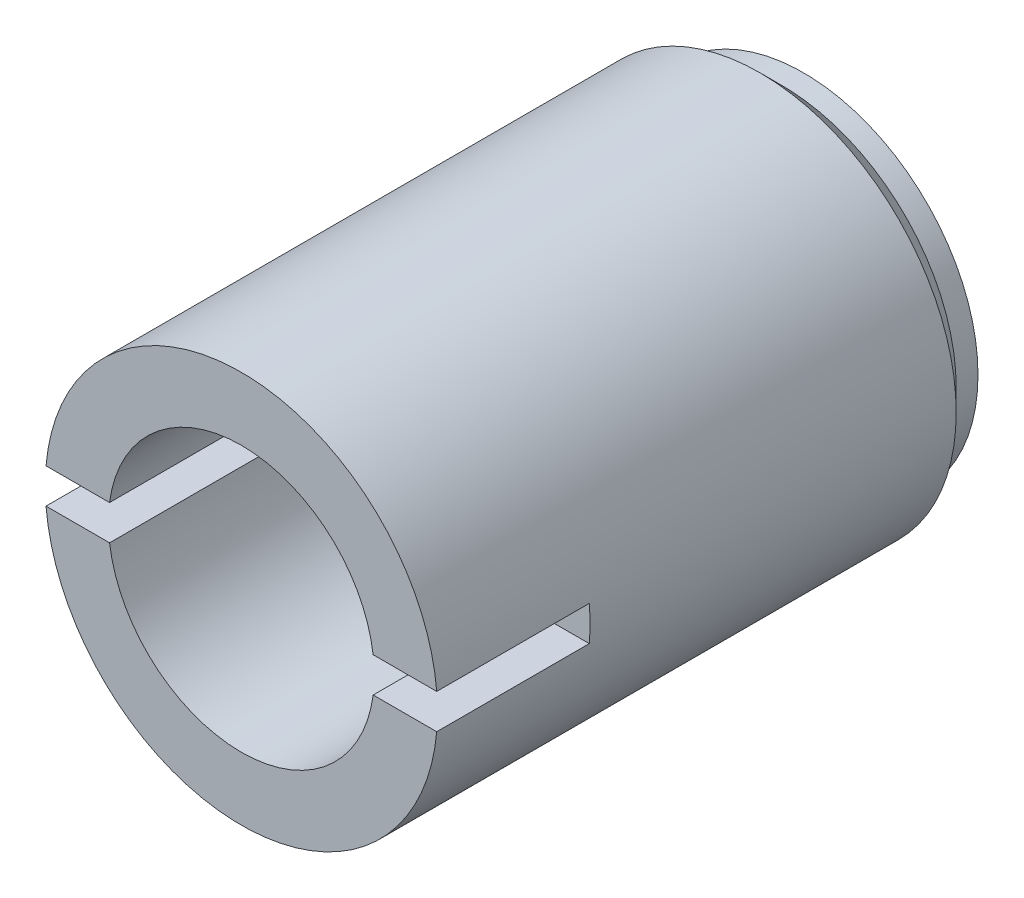
ISO-10303-21;
HEADER;
FILE_DESCRIPTION(('STEP AP214'),'2;1');
FILE_NAME('part.step','',(''),(''),'','','');
FILE_SCHEMA(('AUTOMOTIVE_DESIGN { 1 0 10303 214 1 1 1 1 }'));
ENDSEC;
DATA;
#1=APPLICATION_CONTEXT('core data for automotive mechanical design processes');
#2=APPLICATION_PROTOCOL_DEFINITION('international standard','automotive_design',2000,#1);
#3=PRODUCT_CONTEXT('',#1,'mechanical');
#4=PRODUCT('Part','Part','',(#3));
#5=PRODUCT_RELATED_PRODUCT_CATEGORY('part','',(#4));
#6=PRODUCT_DEFINITION_FORMATION('','',#4);
#7=PRODUCT_DEFINITION_CONTEXT('part definition',#1,'design');
#8=PRODUCT_DEFINITION('design','',#6,#7);
#9=PRODUCT_DEFINITION_SHAPE('','',#8);
#10=(LENGTH_UNIT() NAMED_UNIT(*) SI_UNIT(.MILLI.,.METRE.));
#11=(NAMED_UNIT(*) PLANE_ANGLE_UNIT() SI_UNIT($,.RADIAN.));
#12=(NAMED_UNIT(*) SI_UNIT($,.STERADIAN.) SOLID_ANGLE_UNIT());
#13=UNCERTAINTY_MEASURE_WITH_UNIT(LENGTH_MEASURE(1.E-05),#10,'distance_accuracy_value','');
#14=(GEOMETRIC_REPRESENTATION_CONTEXT(3) GLOBAL_UNCERTAINTY_ASSIGNED_CONTEXT((#13)) GLOBAL_UNIT_ASSIGNED_CONTEXT((#10,
#11,#12)) REPRESENTATION_CONTEXT('',''));
#15=CARTESIAN_POINT('',(0.,0.,0.));
#16=DIRECTION('',(0.,0.,1.));
#17=DIRECTION('',(1.,0.,0.));
#18=AXIS2_PLACEMENT_3D('',#15,#16,#17);
#19=CARTESIAN_POINT('',(0.,0.,12.9));
#20=DIRECTION('',(0.,0.,1.));
#21=DIRECTION('',(1.,0.,0.));
#22=AXIS2_PLACEMENT_3D('',#19,#20,#21);
#23=PLANE('',#22);
#24=CARTESIAN_POINT('',(0.,0.,12.9));
#25=DIRECTION('',(0.,0.,1.));
#26=DIRECTION('',(1.,0.,0.));
#27=AXIS2_PLACEMENT_3D('',#24,#25,#26);
#28=CIRCLE('',#27,4.5);
#29=CARTESIAN_POINT('',(4.48218696620299,0.400000000000001,12.9));
#30=VERTEX_POINT('',#29);
#31=CARTESIAN_POINT('',(-4.48218696620299,0.400000000000001,12.9));
#32=VERTEX_POINT('',#31);
#33=EDGE_CURVE('E156',#30,#32,#28,.T.);
#34=ORIENTED_EDGE('',*,*,#33,.T.);
#35=DIRECTION('',(1.,0.,0.));
#36=VECTOR('',#35,1.);
#37=CARTESIAN_POINT('',(-4.5,0.400000000000001,12.9));
#38=LINE('',#37,#36);
#39=CARTESIAN_POINT('',(-3.02365672654817,0.400000000000001,12.9));
#40=VERTEX_POINT('',#39);
#41=EDGE_CURVE('E176',#32,#40,#38,.T.);
#42=ORIENTED_EDGE('',*,*,#41,.T.);
#43=CARTESIAN_POINT('',(0.,0.,12.9));
#44=DIRECTION('',(0.,0.,1.));
#45=DIRECTION('',(1.,0.,0.));
#46=AXIS2_PLACEMENT_3D('',#43,#44,#45);
#47=CIRCLE('',#46,3.05);
#48=CARTESIAN_POINT('',(3.02365672654817,0.400000000000001,12.9));
#49=VERTEX_POINT('',#48);
#50=EDGE_CURVE('E148',#49,#40,#47,.T.);
#51=ORIENTED_EDGE('',*,*,#50,.F.);
#52=EDGE_CURVE('E65',#49,#30,#38,.T.);
#53=ORIENTED_EDGE('',*,*,#52,.T.);
#54=EDGE_LOOP('',(#34,#42,#51,#53));
#55=FACE_BOUND('',#54,.T.);
#56=ADVANCED_FACE('F41',(#55),#23,.T.);
#57=CARTESIAN_POINT('',(0.,0.,7.9));
#58=DIRECTION('',(0.,0.,1.));
#59=DIRECTION('',(1.,0.,0.));
#60=AXIS2_PLACEMENT_3D('',#57,#58,#59);
#61=PLANE('',#60);
#62=CARTESIAN_POINT('',(0.,0.,7.9));
#63=DIRECTION('',(0.,0.,1.));
#64=DIRECTION('',(1.,0.,0.));
#65=AXIS2_PLACEMENT_3D('',#62,#63,#64);
#66=CIRCLE('',#65,1.6);
#67=CARTESIAN_POINT('',(1.6,0.,7.9));
#68=VERTEX_POINT('',#67);
#69=EDGE_CURVE('E157',#68,#68,#66,.T.);
#70=ORIENTED_EDGE('',*,*,#69,.F.);
#71=EDGE_LOOP('',(#70));
#72=FACE_BOUND('',#71,.T.);
#73=CARTESIAN_POINT('',(0.,0.,7.9));
#74=DIRECTION('',(0.,0.,1.));
#75=DIRECTION('',(1.,0.,0.));
#76=AXIS2_PLACEMENT_3D('',#73,#74,#75);
#77=CIRCLE('',#76,3.05);
#78=CARTESIAN_POINT('',(3.05,0.,7.9));
#79=VERTEX_POINT('',#78);
#80=EDGE_CURVE('E122',#79,#79,#77,.F.);
#81=ORIENTED_EDGE('',*,*,#80,.F.);
#82=EDGE_LOOP('',(#81));
#83=FACE_BOUND('',#82,.T.);
#84=ADVANCED_FACE('F195',(#72,#83),#61,.T.);
#85=CARTESIAN_POINT('',(0.,0.,0.));
#86=DIRECTION('',(0.,0.,1.));
#87=DIRECTION('',(1.,0.,0.));
#88=AXIS2_PLACEMENT_3D('',#85,#86,#87);
#89=PLANE('',#88);
#90=CARTESIAN_POINT('',(0.,0.,0.));
#91=DIRECTION('',(0.,0.,1.));
#92=DIRECTION('',(1.,0.,0.));
#93=AXIS2_PLACEMENT_3D('',#90,#91,#92);
#94=CIRCLE('',#93,1.6);
#95=CARTESIAN_POINT('',(1.6,0.,0.));
#96=VERTEX_POINT('',#95);
#97=EDGE_CURVE('E160',#96,#96,#94,.T.);
#98=ORIENTED_EDGE('',*,*,#97,.T.);
#99=EDGE_LOOP('',(#98));
#100=FACE_BOUND('',#99,.T.);
#101=CARTESIAN_POINT('',(0.,0.,0.));
#102=DIRECTION('',(0.,0.,-1.));
#103=DIRECTION('',(-1.,0.,0.));
#104=AXIS2_PLACEMENT_3D('',#101,#102,#103);
#105=CIRCLE('',#104,4.);
#106=CARTESIAN_POINT('',(-4.,0.,0.));
#107=VERTEX_POINT('',#106);
#108=EDGE_CURVE('E129',#107,#107,#105,.T.);
#109=ORIENTED_EDGE('',*,*,#108,.T.);
#110=EDGE_LOOP('',(#109));
#111=FACE_BOUND('',#110,.T.);
#112=ADVANCED_FACE('F191',(#100,#111),#89,.F.);
#113=CARTESIAN_POINT('',(0.,0.,0.5));
#114=DIRECTION('',(0.,0.,-1.));
#115=DIRECTION('',(-1.,0.,0.));
#116=AXIS2_PLACEMENT_3D('',#113,#114,#115);
#117=CYLINDRICAL_SURFACE('',#116,1.6);
#118=ORIENTED_EDGE('',*,*,#97,.F.);
#119=EDGE_LOOP('',(#118));
#120=FACE_BOUND('',#119,.T.);
#121=ORIENTED_EDGE('',*,*,#69,.T.);
#122=EDGE_LOOP('',(#121));
#123=FACE_BOUND('',#122,.T.);
#124=ADVANCED_FACE('F202',(#120,#123),#117,.F.);
#125=CARTESIAN_POINT('',(0.,0.,7.9));
#126=DIRECTION('',(0.,0.,-1.));
#127=DIRECTION('',(-1.,0.,0.));
#128=AXIS2_PLACEMENT_3D('',#125,#126,#127);
#129=CYLINDRICAL_SURFACE('',#128,4.5);
#130=CARTESIAN_POINT('',(0.,0.,0.999999999999999));
#131=DIRECTION('',(0.,0.,1.));
#132=DIRECTION('',(1.,0.,0.));
#133=AXIS2_PLACEMENT_3D('',#130,#131,#132);
#134=CIRCLE('',#133,4.5);
#135=CARTESIAN_POINT('',(4.5,0.,0.999999999999999));
#136=VERTEX_POINT('',#135);
#137=EDGE_CURVE('E161',#136,#136,#134,.T.);
#138=ORIENTED_EDGE('',*,*,#137,.T.);
#139=EDGE_LOOP('',(#138));
#140=FACE_BOUND('',#139,.T.);
#141=CARTESIAN_POINT('',(0.,0.,9.4));
#142=DIRECTION('',(0.,0.,-1.));
#143=DIRECTION('',(-1.,0.,0.));
#144=AXIS2_PLACEMENT_3D('',#141,#142,#143);
#145=CIRCLE('',#144,4.5);
#146=CARTESIAN_POINT('',(-4.48218696620299,-0.4,9.4));
#147=VERTEX_POINT('',#146);
#148=CARTESIAN_POINT('',(-4.48218696620299,0.4,9.4));
#149=VERTEX_POINT('',#148);
#150=EDGE_CURVE('E150',#147,#149,#145,.T.);
#151=ORIENTED_EDGE('',*,*,#150,.T.);
#152=DIRECTION('',(0.,0.,-1.));
#153=VECTOR('',#152,1.);
#154=CARTESIAN_POINT('',(-4.48218696620299,0.4,7.9));
#155=LINE('',#154,#153);
#156=EDGE_CURVE('E136',#149,#32,#155,.F.);
#157=ORIENTED_EDGE('',*,*,#156,.T.);
#158=ORIENTED_EDGE('',*,*,#33,.F.);
#159=DIRECTION('',(0.,0.,-1.));
#160=VECTOR('',#159,1.);
#161=CARTESIAN_POINT('',(4.48218696620299,0.4,7.9));
#162=LINE('',#161,#160);
#163=CARTESIAN_POINT('',(4.48218696620299,0.4,9.4));
#164=VERTEX_POINT('',#163);
#165=EDGE_CURVE('E138',#30,#164,#162,.T.);
#166=ORIENTED_EDGE('',*,*,#165,.T.);
#167=CARTESIAN_POINT('',(4.48218696620299,-0.4,9.4));
#168=VERTEX_POINT('',#167);
#169=EDGE_CURVE('E146',#164,#168,#145,.T.);
#170=ORIENTED_EDGE('',*,*,#169,.T.);
#171=DIRECTION('',(0.,0.,-1.));
#172=VECTOR('',#171,1.);
#173=CARTESIAN_POINT('',(4.48218696620299,-0.399999999999999,7.9));
#174=LINE('',#173,#172);
#175=CARTESIAN_POINT('',(4.48218696620299,-0.400000000000001,12.9));
#176=VERTEX_POINT('',#175);
#177=EDGE_CURVE('E127',#168,#176,#174,.F.);
#178=ORIENTED_EDGE('',*,*,#177,.T.);
#179=CARTESIAN_POINT('',(-4.48218696620299,-0.400000000000001,12.9));
#180=VERTEX_POINT('',#179);
#181=EDGE_CURVE('E151',#180,#176,#28,.T.);
#182=ORIENTED_EDGE('',*,*,#181,.F.);
#183=DIRECTION('',(0.,0.,-1.));
#184=VECTOR('',#183,1.);
#185=CARTESIAN_POINT('',(-4.48218696620299,-0.399999999999999,7.9));
#186=LINE('',#185,#184);
#187=EDGE_CURVE('E144',#180,#147,#186,.T.);
#188=ORIENTED_EDGE('',*,*,#187,.T.);
#189=EDGE_LOOP('',(#151,#157,#158,#166,#170,#178,#182,#188));
#190=FACE_BOUND('',#189,.T.);
#191=ADVANCED_FACE('F208',(#140,#190),#129,.T.);
#192=CARTESIAN_POINT('',(0.,0.,0.999999999999999));
#193=DIRECTION('',(0.,0.,1.));
#194=DIRECTION('',(1.,0.,0.));
#195=AXIS2_PLACEMENT_3D('',#192,#193,#194);
#196=CONICAL_SURFACE('',#195,4.5,0.78539816339745);
#197=CARTESIAN_POINT('',(0.,0.,0.5));
#198=DIRECTION('',(0.,0.,1.));
#199=DIRECTION('',(1.,0.,0.));
#200=AXIS2_PLACEMENT_3D('',#197,#198,#199);
#201=CIRCLE('',#200,4.);
#202=CARTESIAN_POINT('',(4.,0.,0.5));
#203=VERTEX_POINT('',#202);
#204=EDGE_CURVE('E168',#203,#203,#201,.F.);
#205=ORIENTED_EDGE('',*,*,#204,.F.);
#206=EDGE_LOOP('',(#205));
#207=FACE_BOUND('',#206,.T.);
#208=ORIENTED_EDGE('',*,*,#137,.F.);
#209=EDGE_LOOP('',(#208));
#210=FACE_BOUND('',#209,.T.);
#211=ADVANCED_FACE('F42',(#207,#210),#196,.T.);
#212=DIRECTION('',(1.,0.,0.));
#213=VECTOR('',#212,1.);
#214=CARTESIAN_POINT('',(-4.5,-0.400000000000001,12.9));
#215=LINE('',#214,#213);
#216=CARTESIAN_POINT('',(-3.02365672654817,-0.400000000000001,12.9));
#217=VERTEX_POINT('',#216);
#218=EDGE_CURVE('E140',#180,#217,#215,.T.);
#219=ORIENTED_EDGE('',*,*,#218,.F.);
#220=ORIENTED_EDGE('',*,*,#181,.T.);
#221=CARTESIAN_POINT('',(3.02365672654817,-0.400000000000001,12.9));
#222=VERTEX_POINT('',#221);
#223=EDGE_CURVE('E184',#222,#176,#215,.T.);
#224=ORIENTED_EDGE('',*,*,#223,.F.);
#225=EDGE_CURVE('E109',#217,#222,#47,.T.);
#226=ORIENTED_EDGE('',*,*,#225,.F.);
#227=EDGE_LOOP('',(#219,#220,#224,#226));
#228=FACE_BOUND('',#227,.T.);
#229=ADVANCED_FACE('F207',(#228),#23,.T.);
#230=CARTESIAN_POINT('',(0.,0.,12.9));
#231=DIRECTION('',(0.,0.,-1.));
#232=DIRECTION('',(-1.,0.,0.));
#233=AXIS2_PLACEMENT_3D('',#230,#231,#232);
#234=CYLINDRICAL_SURFACE('',#233,3.05);
#235=DIRECTION('',(0.,0.,-1.));
#236=VECTOR('',#235,1.);
#237=CARTESIAN_POINT('',(3.02365672654817,0.400000000000001,12.9));
#238=LINE('',#237,#236);
#239=CARTESIAN_POINT('',(3.02365672654817,0.4,9.4));
#240=VERTEX_POINT('',#239);
#241=EDGE_CURVE('E60',#49,#240,#238,.T.);
#242=ORIENTED_EDGE('',*,*,#241,.F.);
#243=ORIENTED_EDGE('',*,*,#50,.T.);
#244=DIRECTION('',(0.,0.,-1.));
#245=VECTOR('',#244,1.);
#246=CARTESIAN_POINT('',(-3.02365672654817,0.400000000000001,12.9));
#247=LINE('',#246,#245);
#248=CARTESIAN_POINT('',(-3.02365672654817,0.4,9.4));
#249=VERTEX_POINT('',#248);
#250=EDGE_CURVE('E169',#249,#40,#247,.F.);
#251=ORIENTED_EDGE('',*,*,#250,.F.);
#252=CARTESIAN_POINT('',(0.,0.,9.4));
#253=DIRECTION('',(0.,0.,-1.));
#254=DIRECTION('',(-1.,0.,0.));
#255=AXIS2_PLACEMENT_3D('',#252,#253,#254);
#256=CIRCLE('',#255,3.05);
#257=CARTESIAN_POINT('',(-3.02365672654817,-0.4,9.4));
#258=VERTEX_POINT('',#257);
#259=EDGE_CURVE('E119',#258,#249,#256,.T.);
#260=ORIENTED_EDGE('',*,*,#259,.F.);
#261=DIRECTION('',(0.,0.,-1.));
#262=VECTOR('',#261,1.);
#263=CARTESIAN_POINT('',(-3.02365672654817,-0.400000000000001,12.9));
#264=LINE('',#263,#262);
#265=EDGE_CURVE('E11',#217,#258,#264,.T.);
#266=ORIENTED_EDGE('',*,*,#265,.F.);
#267=ORIENTED_EDGE('',*,*,#225,.T.);
#268=DIRECTION('',(0.,0.,-1.));
#269=VECTOR('',#268,1.);
#270=CARTESIAN_POINT('',(3.02365672654817,-0.400000000000001,12.9));
#271=LINE('',#270,#269);
#272=CARTESIAN_POINT('',(3.02365672654817,-0.4,9.4));
#273=VERTEX_POINT('',#272);
#274=EDGE_CURVE('E49',#273,#222,#271,.F.);
#275=ORIENTED_EDGE('',*,*,#274,.F.);
#276=CARTESIAN_POINT('',(0.,0.,9.4));
#277=DIRECTION('',(0.,0.,-1.));
#278=DIRECTION('',(-1.,0.,0.));
#279=AXIS2_PLACEMENT_3D('',#276,#277,#278);
#280=CIRCLE('',#279,3.05);
#281=EDGE_CURVE('E106',#240,#273,#280,.T.);
#282=ORIENTED_EDGE('',*,*,#281,.F.);
#283=EDGE_LOOP('',(#242,#243,#251,#260,#266,#267,#275,#282));
#284=FACE_BOUND('',#283,.T.);
#285=ORIENTED_EDGE('',*,*,#80,.T.);
#286=EDGE_LOOP('',(#285));
#287=FACE_BOUND('',#286,.T.);
#288=ADVANCED_FACE('F104',(#284,#287),#234,.F.);
#289=CARTESIAN_POINT('',(-4.5,-0.400000000000001,12.9));
#290=DIRECTION('',(0.,-1.,0.));
#291=DIRECTION('',(0.,0.,-1.));
#292=AXIS2_PLACEMENT_3D('',#289,#290,#291);
#293=PLANE('',#292);
#294=ORIENTED_EDGE('',*,*,#265,.T.);
#295=DIRECTION('',(1.,0.,0.));
#296=VECTOR('',#295,1.);
#297=CARTESIAN_POINT('',(-4.5,-0.4,9.4));
#298=LINE('',#297,#296);
#299=EDGE_CURVE('E130',#147,#258,#298,.T.);
#300=ORIENTED_EDGE('',*,*,#299,.F.);
#301=ORIENTED_EDGE('',*,*,#187,.F.);
#302=ORIENTED_EDGE('',*,*,#218,.T.);
#303=EDGE_LOOP('',(#294,#300,#301,#302));
#304=FACE_BOUND('',#303,.T.);
#305=ADVANCED_FACE('F239',(#304),#293,.F.);
#306=CARTESIAN_POINT('',(-4.5,0.400000000000001,12.9));
#307=DIRECTION('',(0.,1.,0.));
#308=DIRECTION('',(0.,0.,1.));
#309=AXIS2_PLACEMENT_3D('',#306,#307,#308);
#310=PLANE('',#309);
#311=DIRECTION('',(1.,0.,0.));
#312=VECTOR('',#311,1.);
#313=CARTESIAN_POINT('',(-4.5,0.4,9.4));
#314=LINE('',#313,#312);
#315=EDGE_CURVE('E178',#149,#249,#314,.T.);
#316=ORIENTED_EDGE('',*,*,#315,.T.);
#317=ORIENTED_EDGE('',*,*,#250,.T.);
#318=ORIENTED_EDGE('',*,*,#41,.F.);
#319=ORIENTED_EDGE('',*,*,#156,.F.);
#320=EDGE_LOOP('',(#316,#317,#318,#319));
#321=FACE_BOUND('',#320,.T.);
#322=ADVANCED_FACE('F172',(#321),#310,.F.);
#323=CARTESIAN_POINT('',(-4.5,-0.4,9.4));
#324=DIRECTION('',(0.,0.,-1.));
#325=DIRECTION('',(-1.,0.,0.));
#326=AXIS2_PLACEMENT_3D('',#323,#324,#325);
#327=PLANE('',#326);
#328=ORIENTED_EDGE('',*,*,#299,.T.);
#329=ORIENTED_EDGE('',*,*,#259,.T.);
#330=ORIENTED_EDGE('',*,*,#315,.F.);
#331=ORIENTED_EDGE('',*,*,#150,.F.);
#332=EDGE_LOOP('',(#328,#329,#330,#331));
#333=FACE_BOUND('',#332,.T.);
#334=ADVANCED_FACE('F236',(#333),#327,.F.);
#335=EDGE_CURVE('E118',#240,#164,#314,.T.);
#336=ORIENTED_EDGE('',*,*,#335,.F.);
#337=ORIENTED_EDGE('',*,*,#281,.T.);
#338=EDGE_CURVE('E120',#273,#168,#298,.T.);
#339=ORIENTED_EDGE('',*,*,#338,.T.);
#340=ORIENTED_EDGE('',*,*,#169,.F.);
#341=EDGE_LOOP('',(#336,#337,#339,#340));
#342=FACE_BOUND('',#341,.T.);
#343=ADVANCED_FACE('F114',(#342),#327,.F.);
#344=ORIENTED_EDGE('',*,*,#338,.F.);
#345=ORIENTED_EDGE('',*,*,#274,.T.);
#346=ORIENTED_EDGE('',*,*,#223,.T.);
#347=ORIENTED_EDGE('',*,*,#177,.F.);
#348=EDGE_LOOP('',(#344,#345,#346,#347));
#349=FACE_BOUND('',#348,.T.);
#350=ADVANCED_FACE('F121',(#349),#293,.F.);
#351=ORIENTED_EDGE('',*,*,#241,.T.);
#352=ORIENTED_EDGE('',*,*,#335,.T.);
#353=ORIENTED_EDGE('',*,*,#165,.F.);
#354=ORIENTED_EDGE('',*,*,#52,.F.);
#355=EDGE_LOOP('',(#351,#352,#353,#354));
#356=FACE_BOUND('',#355,.T.);
#357=ADVANCED_FACE('F228',(#356),#310,.F.);
#358=CARTESIAN_POINT('',(0.,0.,11.8137084989847));
#359=DIRECTION('',(0.,0.,-1.));
#360=DIRECTION('',(-1.,0.,0.));
#361=AXIS2_PLACEMENT_3D('',#358,#359,#360);
#362=CYLINDRICAL_SURFACE('',#361,4.);
#363=ORIENTED_EDGE('',*,*,#108,.F.);
#364=EDGE_LOOP('',(#363));
#365=FACE_BOUND('',#364,.T.);
#366=ORIENTED_EDGE('',*,*,#204,.T.);
#367=EDGE_LOOP('',(#366));
#368=FACE_BOUND('',#367,.T.);
#369=ADVANCED_FACE('F223',(#365,#368),#362,.T.);
#370=CLOSED_SHELL('',(#56,#84,#112,#124,#191,#211,#229,#288,#305,#322,#334,#343,#350,#357,#369));
#371=MANIFOLD_SOLID_BREP('B2',#370);
#372=ADVANCED_BREP_SHAPE_REPRESENTATION('',(#18,#371),#14);
#373=SHAPE_DEFINITION_REPRESENTATION(#9,#372);
ENDSEC;
END-ISO-10303-21;
